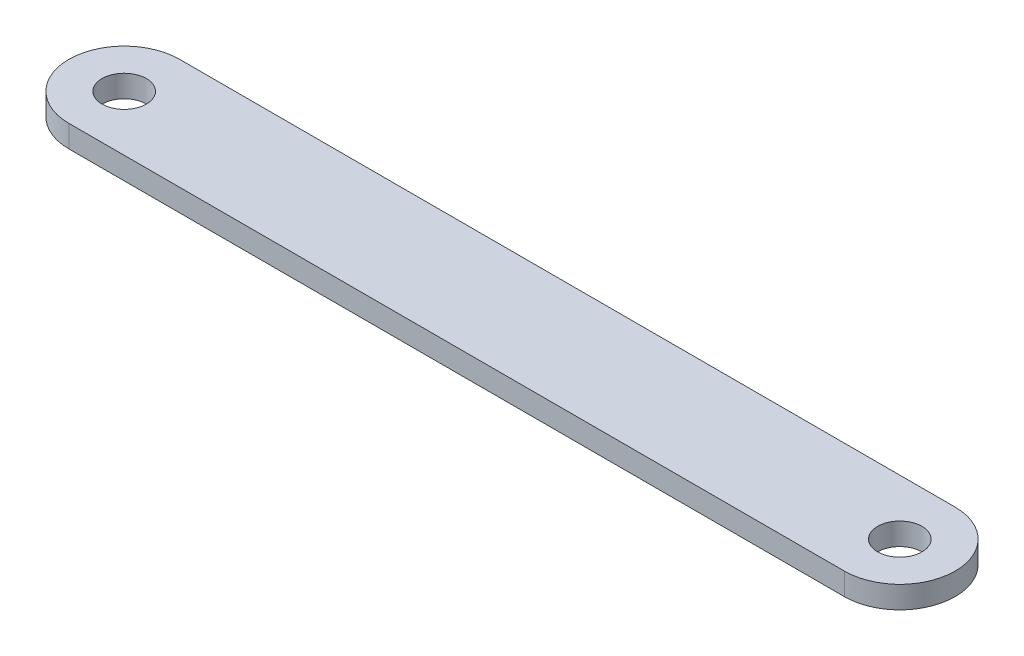
ISO-10303-21;
HEADER;
FILE_DESCRIPTION(('STEP AP214'),'2;1');
FILE_NAME('part.step','',(''),(''),'','','');
FILE_SCHEMA(('AUTOMOTIVE_DESIGN { 1 0 10303 214 1 1 1 1 }'));
ENDSEC;
DATA;
#1=APPLICATION_CONTEXT('core data for automotive mechanical design processes');
#2=APPLICATION_PROTOCOL_DEFINITION('international standard','automotive_design',2000,#1);
#3=PRODUCT_CONTEXT('',#1,'mechanical');
#4=PRODUCT('Part','Part','',(#3));
#5=PRODUCT_RELATED_PRODUCT_CATEGORY('part','',(#4));
#6=PRODUCT_DEFINITION_FORMATION('','',#4);
#7=PRODUCT_DEFINITION_CONTEXT('part definition',#1,'design');
#8=PRODUCT_DEFINITION('design','',#6,#7);
#9=PRODUCT_DEFINITION_SHAPE('','',#8);
#10=(LENGTH_UNIT() NAMED_UNIT(*) SI_UNIT(.MILLI.,.METRE.));
#11=(NAMED_UNIT(*) PLANE_ANGLE_UNIT() SI_UNIT($,.RADIAN.));
#12=(NAMED_UNIT(*) SI_UNIT($,.STERADIAN.) SOLID_ANGLE_UNIT());
#13=UNCERTAINTY_MEASURE_WITH_UNIT(LENGTH_MEASURE(1.E-05),#10,'distance_accuracy_value','');
#14=(GEOMETRIC_REPRESENTATION_CONTEXT(3) GLOBAL_UNCERTAINTY_ASSIGNED_CONTEXT((#13)) GLOBAL_UNIT_ASSIGNED_CONTEXT((#10,
#11,#12)) REPRESENTATION_CONTEXT('',''));
#15=CARTESIAN_POINT('',(0.,0.,0.));
#16=DIRECTION('',(0.,0.,1.));
#17=DIRECTION('',(1.,0.,0.));
#18=AXIS2_PLACEMENT_3D('',#15,#16,#17);
#19=CARTESIAN_POINT('',(0.,2.54,-6.35));
#20=DIRECTION('',(0.,1.,0.));
#21=DIRECTION('',(0.,0.,1.));
#22=AXIS2_PLACEMENT_3D('',#19,#20,#21);
#23=PLANE('',#22);
#24=CARTESIAN_POINT('',(0.,2.54,-6.35));
#25=DIRECTION('',(0.,1.,0.));
#26=DIRECTION('',(0.,0.,1.));
#27=AXIS2_PLACEMENT_3D('',#24,#25,#26);
#28=CIRCLE('',#27,2.54);
#29=CARTESIAN_POINT('',(0.,2.54,-3.81));
#30=VERTEX_POINT('',#29);
#31=EDGE_CURVE('E100',#30,#30,#28,.T.);
#32=ORIENTED_EDGE('',*,*,#31,.F.);
#33=EDGE_LOOP('',(#32));
#34=FACE_BOUND('',#33,.T.);
#35=CARTESIAN_POINT('',(0.,2.54,-6.35));
#36=DIRECTION('',(0.,1.,0.));
#37=DIRECTION('',(0.,0.,1.));
#38=AXIS2_PLACEMENT_3D('',#35,#36,#37);
#39=CIRCLE('',#38,6.35);
#40=CARTESIAN_POINT('',(0.,2.54,-12.7));
#41=VERTEX_POINT('',#40);
#42=CARTESIAN_POINT('',(0.,2.54,0.));
#43=VERTEX_POINT('',#42);
#44=EDGE_CURVE('E85',#41,#43,#39,.T.);
#45=ORIENTED_EDGE('',*,*,#44,.T.);
#46=DIRECTION('',(1.,0.,0.));
#47=VECTOR('',#46,1.);
#48=CARTESIAN_POINT('',(0.,2.54,0.));
#49=LINE('',#48,#47);
#50=CARTESIAN_POINT('',(88.9,2.54,0.));
#51=VERTEX_POINT('',#50);
#52=EDGE_CURVE('E80',#43,#51,#49,.T.);
#53=ORIENTED_EDGE('',*,*,#52,.T.);
#54=CARTESIAN_POINT('',(88.9,2.54,-6.35));
#55=DIRECTION('',(0.,1.,0.));
#56=DIRECTION('',(0.,0.,-1.));
#57=AXIS2_PLACEMENT_3D('',#54,#55,#56);
#58=CIRCLE('',#57,6.35);
#59=CARTESIAN_POINT('',(88.9,2.54,-12.7));
#60=VERTEX_POINT('',#59);
#61=EDGE_CURVE('E83',#51,#60,#58,.T.);
#62=ORIENTED_EDGE('',*,*,#61,.T.);
#63=DIRECTION('',(-1.,0.,0.));
#64=VECTOR('',#63,1.);
#65=CARTESIAN_POINT('',(0.,2.54,-12.7));
#66=LINE('',#65,#64);
#67=EDGE_CURVE('E50',#60,#41,#66,.T.);
#68=ORIENTED_EDGE('',*,*,#67,.T.);
#69=EDGE_LOOP('',(#45,#53,#62,#68));
#70=FACE_BOUND('',#69,.T.);
#71=CARTESIAN_POINT('',(88.9,2.54,-6.35));
#72=DIRECTION('',(0.,1.,0.));
#73=DIRECTION('',(0.,0.,1.));
#74=AXIS2_PLACEMENT_3D('',#71,#72,#73);
#75=CIRCLE('',#74,2.54);
#76=CARTESIAN_POINT('',(88.9,2.54,-3.81));
#77=VERTEX_POINT('',#76);
#78=EDGE_CURVE('E115',#77,#77,#75,.T.);
#79=ORIENTED_EDGE('',*,*,#78,.F.);
#80=EDGE_LOOP('',(#79));
#81=FACE_BOUND('',#80,.T.);
#82=ADVANCED_FACE('F33',(#34,#70,#81),#23,.T.);
#83=CARTESIAN_POINT('',(0.,0.,-6.35));
#84=DIRECTION('',(0.,1.,0.));
#85=DIRECTION('',(0.,0.,1.));
#86=AXIS2_PLACEMENT_3D('',#83,#84,#85);
#87=PLANE('',#86);
#88=CARTESIAN_POINT('',(0.,0.,-6.35));
#89=DIRECTION('',(0.,1.,0.));
#90=DIRECTION('',(0.,0.,1.));
#91=AXIS2_PLACEMENT_3D('',#88,#89,#90);
#92=CIRCLE('',#91,2.54);
#93=CARTESIAN_POINT('',(0.,0.,-3.81));
#94=VERTEX_POINT('',#93);
#95=EDGE_CURVE('E112',#94,#94,#92,.T.);
#96=ORIENTED_EDGE('',*,*,#95,.T.);
#97=EDGE_LOOP('',(#96));
#98=FACE_BOUND('',#97,.T.);
#99=CARTESIAN_POINT('',(0.,0.,-6.35));
#100=DIRECTION('',(0.,1.,0.));
#101=DIRECTION('',(0.,0.,1.));
#102=AXIS2_PLACEMENT_3D('',#99,#100,#101);
#103=CIRCLE('',#102,6.35);
#104=CARTESIAN_POINT('',(0.,0.,-12.7));
#105=VERTEX_POINT('',#104);
#106=CARTESIAN_POINT('',(0.,0.,0.));
#107=VERTEX_POINT('',#106);
#108=EDGE_CURVE('E97',#105,#107,#103,.T.);
#109=ORIENTED_EDGE('',*,*,#108,.F.);
#110=DIRECTION('',(-1.,0.,0.));
#111=VECTOR('',#110,1.);
#112=CARTESIAN_POINT('',(0.,0.,-12.7));
#113=LINE('',#112,#111);
#114=CARTESIAN_POINT('',(88.9,0.,-12.7));
#115=VERTEX_POINT('',#114);
#116=EDGE_CURVE('E73',#115,#105,#113,.T.);
#117=ORIENTED_EDGE('',*,*,#116,.F.);
#118=CARTESIAN_POINT('',(88.9,0.,-6.35));
#119=DIRECTION('',(0.,1.,0.));
#120=DIRECTION('',(0.,0.,-1.));
#121=AXIS2_PLACEMENT_3D('',#118,#119,#120);
#122=CIRCLE('',#121,6.35);
#123=CARTESIAN_POINT('',(88.9,0.,0.));
#124=VERTEX_POINT('',#123);
#125=EDGE_CURVE('E67',#124,#115,#122,.T.);
#126=ORIENTED_EDGE('',*,*,#125,.F.);
#127=DIRECTION('',(1.,0.,0.));
#128=VECTOR('',#127,1.);
#129=CARTESIAN_POINT('',(0.,0.,0.));
#130=LINE('',#129,#128);
#131=EDGE_CURVE('E89',#107,#124,#130,.T.);
#132=ORIENTED_EDGE('',*,*,#131,.F.);
#133=EDGE_LOOP('',(#109,#117,#126,#132));
#134=FACE_BOUND('',#133,.T.);
#135=CARTESIAN_POINT('',(88.9,0.,-6.35));
#136=DIRECTION('',(0.,1.,0.));
#137=DIRECTION('',(0.,0.,1.));
#138=AXIS2_PLACEMENT_3D('',#135,#136,#137);
#139=CIRCLE('',#138,2.54);
#140=CARTESIAN_POINT('',(88.9,0.,-3.81));
#141=VERTEX_POINT('',#140);
#142=EDGE_CURVE('E118',#141,#141,#139,.T.);
#143=ORIENTED_EDGE('',*,*,#142,.T.);
#144=EDGE_LOOP('',(#143));
#145=FACE_BOUND('',#144,.T.);
#146=ADVANCED_FACE('F108',(#98,#134,#145),#87,.F.);
#147=CARTESIAN_POINT('',(0.,2.54,-6.35));
#148=DIRECTION('',(0.,-1.,0.));
#149=DIRECTION('',(0.,0.,-1.));
#150=AXIS2_PLACEMENT_3D('',#147,#148,#149);
#151=CYLINDRICAL_SURFACE('',#150,6.35);
#152=ORIENTED_EDGE('',*,*,#108,.T.);
#153=DIRECTION('',(0.,-1.,0.));
#154=VECTOR('',#153,1.);
#155=CARTESIAN_POINT('',(0.,2.54,0.));
#156=LINE('',#155,#154);
#157=EDGE_CURVE('E11',#43,#107,#156,.T.);
#158=ORIENTED_EDGE('',*,*,#157,.F.);
#159=ORIENTED_EDGE('',*,*,#44,.F.);
#160=DIRECTION('',(0.,-1.,0.));
#161=VECTOR('',#160,1.);
#162=CARTESIAN_POINT('',(0.,2.54,-12.7));
#163=LINE('',#162,#161);
#164=EDGE_CURVE('E93',#41,#105,#163,.T.);
#165=ORIENTED_EDGE('',*,*,#164,.T.);
#166=EDGE_LOOP('',(#152,#158,#159,#165));
#167=FACE_BOUND('',#166,.T.);
#168=ADVANCED_FACE('F35',(#167),#151,.T.);
#169=CARTESIAN_POINT('',(0.,2.54,0.));
#170=DIRECTION('',(0.,0.,-1.));
#171=DIRECTION('',(-1.,0.,0.));
#172=AXIS2_PLACEMENT_3D('',#169,#170,#171);
#173=PLANE('',#172);
#174=ORIENTED_EDGE('',*,*,#131,.T.);
#175=DIRECTION('',(0.,-1.,0.));
#176=VECTOR('',#175,1.);
#177=CARTESIAN_POINT('',(88.9,2.54,0.));
#178=LINE('',#177,#176);
#179=EDGE_CURVE('E42',#51,#124,#178,.T.);
#180=ORIENTED_EDGE('',*,*,#179,.F.);
#181=ORIENTED_EDGE('',*,*,#52,.F.);
#182=ORIENTED_EDGE('',*,*,#157,.T.);
#183=EDGE_LOOP('',(#174,#180,#181,#182));
#184=FACE_BOUND('',#183,.T.);
#185=ADVANCED_FACE('F88',(#184),#173,.F.);
#186=CARTESIAN_POINT('',(88.9,2.54,-6.35));
#187=DIRECTION('',(0.,-1.,0.));
#188=DIRECTION('',(0.,0.,-1.));
#189=AXIS2_PLACEMENT_3D('',#186,#187,#188);
#190=CYLINDRICAL_SURFACE('',#189,6.35);
#191=ORIENTED_EDGE('',*,*,#125,.T.);
#192=DIRECTION('',(0.,-1.,0.));
#193=VECTOR('',#192,1.);
#194=CARTESIAN_POINT('',(88.9,2.54,-12.7));
#195=LINE('',#194,#193);
#196=EDGE_CURVE('E90',#60,#115,#195,.T.);
#197=ORIENTED_EDGE('',*,*,#196,.F.);
#198=ORIENTED_EDGE('',*,*,#61,.F.);
#199=ORIENTED_EDGE('',*,*,#179,.T.);
#200=EDGE_LOOP('',(#191,#197,#198,#199));
#201=FACE_BOUND('',#200,.T.);
#202=ADVANCED_FACE('F91',(#201),#190,.T.);
#203=CARTESIAN_POINT('',(0.,2.54,-12.7));
#204=DIRECTION('',(0.,0.,1.));
#205=DIRECTION('',(1.,0.,0.));
#206=AXIS2_PLACEMENT_3D('',#203,#204,#205);
#207=PLANE('',#206);
#208=ORIENTED_EDGE('',*,*,#116,.T.);
#209=ORIENTED_EDGE('',*,*,#164,.F.);
#210=ORIENTED_EDGE('',*,*,#67,.F.);
#211=ORIENTED_EDGE('',*,*,#196,.T.);
#212=EDGE_LOOP('',(#208,#209,#210,#211));
#213=FACE_BOUND('',#212,.T.);
#214=ADVANCED_FACE('F105',(#213),#207,.F.);
#215=CARTESIAN_POINT('',(0.,2.54,-6.35));
#216=DIRECTION('',(0.,-1.,0.));
#217=DIRECTION('',(0.,0.,-1.));
#218=AXIS2_PLACEMENT_3D('',#215,#216,#217);
#219=CYLINDRICAL_SURFACE('',#218,2.54);
#220=ORIENTED_EDGE('',*,*,#31,.T.);
#221=EDGE_LOOP('',(#220));
#222=FACE_BOUND('',#221,.T.);
#223=ORIENTED_EDGE('',*,*,#95,.F.);
#224=EDGE_LOOP('',(#223));
#225=FACE_BOUND('',#224,.T.);
#226=ADVANCED_FACE('F136',(#222,#225),#219,.F.);
#227=CARTESIAN_POINT('',(88.9,2.54,-6.35));
#228=DIRECTION('',(0.,-1.,0.));
#229=DIRECTION('',(0.,0.,-1.));
#230=AXIS2_PLACEMENT_3D('',#227,#228,#229);
#231=CYLINDRICAL_SURFACE('',#230,2.54);
#232=ORIENTED_EDGE('',*,*,#78,.T.);
#233=EDGE_LOOP('',(#232));
#234=FACE_BOUND('',#233,.T.);
#235=ORIENTED_EDGE('',*,*,#142,.F.);
#236=EDGE_LOOP('',(#235));
#237=FACE_BOUND('',#236,.T.);
#238=ADVANCED_FACE('F124',(#234,#237),#231,.F.);
#239=CLOSED_SHELL('',(#82,#146,#168,#185,#202,#214,#226,#238));
#240=MANIFOLD_SOLID_BREP('B2',#239);
#241=ADVANCED_BREP_SHAPE_REPRESENTATION('',(#18,#240),#14);
#242=SHAPE_DEFINITION_REPRESENTATION(#9,#241);
ENDSEC;
END-ISO-10303-21;
